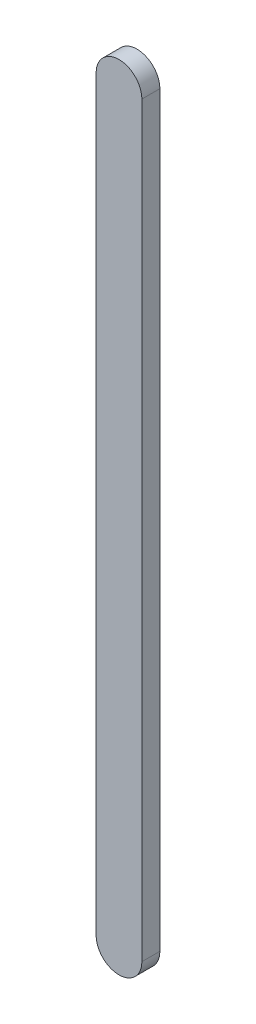
ISO-10303-21;
HEADER;
FILE_DESCRIPTION(('STEP AP214'),'2;1');
FILE_NAME('part.step','',(''),(''),'','','');
FILE_SCHEMA(('AUTOMOTIVE_DESIGN { 1 0 10303 214 1 1 1 1 }'));
ENDSEC;
DATA;
#1=APPLICATION_CONTEXT('core data for automotive mechanical design processes');
#2=APPLICATION_PROTOCOL_DEFINITION('international standard','automotive_design',2000,#1);
#3=PRODUCT_CONTEXT('',#1,'mechanical');
#4=PRODUCT('Part','Part','',(#3));
#5=PRODUCT_RELATED_PRODUCT_CATEGORY('part','',(#4));
#6=PRODUCT_DEFINITION_FORMATION('','',#4);
#7=PRODUCT_DEFINITION_CONTEXT('part definition',#1,'design');
#8=PRODUCT_DEFINITION('design','',#6,#7);
#9=PRODUCT_DEFINITION_SHAPE('','',#8);
#10=(LENGTH_UNIT() NAMED_UNIT(*) SI_UNIT(.MILLI.,.METRE.));
#11=(NAMED_UNIT(*) PLANE_ANGLE_UNIT() SI_UNIT($,.RADIAN.));
#12=(NAMED_UNIT(*) SI_UNIT($,.STERADIAN.) SOLID_ANGLE_UNIT());
#13=UNCERTAINTY_MEASURE_WITH_UNIT(LENGTH_MEASURE(1.E-05),#10,'distance_accuracy_value','');
#14=(GEOMETRIC_REPRESENTATION_CONTEXT(3) GLOBAL_UNCERTAINTY_ASSIGNED_CONTEXT((#13)) GLOBAL_UNIT_ASSIGNED_CONTEXT((#10,
#11,#12)) REPRESENTATION_CONTEXT('',''));
#15=CARTESIAN_POINT('',(0.,0.,0.));
#16=DIRECTION('',(0.,0.,1.));
#17=DIRECTION('',(1.,0.,0.));
#18=AXIS2_PLACEMENT_3D('',#15,#16,#17);
#19=CARTESIAN_POINT('',(92.0496,56.746902,0.));
#20=DIRECTION('',(-1.,0.,0.));
#21=DIRECTION('',(0.,1.,0.));
#22=AXIS2_PLACEMENT_3D('',#19,#20,#21);
#23=PLANE('',#22);
#24=DIRECTION('',(0.,1.,0.));
#25=VECTOR('',#24,1.);
#26=CARTESIAN_POINT('',(92.0496,56.746902,0.1999996));
#27=LINE('',#26,#25);
#28=CARTESIAN_POINT('',(92.0496,56.746902,0.1999996));
#29=VERTEX_POINT('',#28);
#30=CARTESIAN_POINT('',(92.0496,65.0494,0.1999996));
#31=VERTEX_POINT('',#30);
#32=EDGE_CURVE('E11',#29,#31,#27,.T.);
#33=ORIENTED_EDGE('',*,*,#32,.F.);
#34=DIRECTION('',(0.,0.,1.));
#35=VECTOR('',#34,1.);
#36=CARTESIAN_POINT('',(92.0496,56.746902,0.));
#37=LINE('',#36,#35);
#38=CARTESIAN_POINT('',(92.0496,56.746902,0.));
#39=VERTEX_POINT('',#38);
#40=EDGE_CURVE('E24',#39,#29,#37,.T.);
#41=ORIENTED_EDGE('',*,*,#40,.F.);
#42=DIRECTION('',(0.,1.,0.));
#43=VECTOR('',#42,1.);
#44=CARTESIAN_POINT('',(92.0496,56.746902,0.));
#45=LINE('',#44,#43);
#46=CARTESIAN_POINT('',(92.0496,65.0494,0.));
#47=VERTEX_POINT('',#46);
#48=EDGE_CURVE('E75',#39,#47,#45,.T.);
#49=ORIENTED_EDGE('',*,*,#48,.T.);
#50=DIRECTION('',(0.,0.,1.));
#51=VECTOR('',#50,1.);
#52=CARTESIAN_POINT('',(92.0496,65.0494,0.));
#53=LINE('',#52,#51);
#54=EDGE_CURVE('E37',#47,#31,#53,.T.);
#55=ORIENTED_EDGE('',*,*,#54,.T.);
#56=EDGE_LOOP('',(#33,#41,#49,#55));
#57=FACE_BOUND('',#56,.T.);
#58=ADVANCED_FACE('F17',(#57),#23,.F.);
#59=CARTESIAN_POINT('',(91.7956,65.0494,0.));
#60=DIRECTION('',(0.,0.,-1.));
#61=DIRECTION('',(1.,0.,0.));
#62=AXIS2_PLACEMENT_3D('',#59,#60,#61);
#63=CYLINDRICAL_SURFACE('',#62,0.253999999999995);
#64=CARTESIAN_POINT('',(91.7956,65.0494,0.1999996));
#65=DIRECTION('',(0.,0.,1.));
#66=DIRECTION('',(1.,0.,0.));
#67=AXIS2_PLACEMENT_3D('',#64,#65,#66);
#68=CIRCLE('',#67,0.253999999999995);
#69=CARTESIAN_POINT('',(91.5416,65.0494,0.1999996));
#70=VERTEX_POINT('',#69);
#71=EDGE_CURVE('E83',#31,#70,#68,.T.);
#72=ORIENTED_EDGE('',*,*,#71,.F.);
#73=ORIENTED_EDGE('',*,*,#54,.F.);
#74=CARTESIAN_POINT('',(91.7956,65.0494,0.));
#75=DIRECTION('',(0.,0.,1.));
#76=DIRECTION('',(1.,0.,0.));
#77=AXIS2_PLACEMENT_3D('',#74,#75,#76);
#78=CIRCLE('',#77,0.253999999999995);
#79=CARTESIAN_POINT('',(91.5416,65.0494,0.));
#80=VERTEX_POINT('',#79);
#81=EDGE_CURVE('E81',#47,#80,#78,.T.);
#82=ORIENTED_EDGE('',*,*,#81,.T.);
#83=DIRECTION('',(0.,0.,1.));
#84=VECTOR('',#83,1.);
#85=CARTESIAN_POINT('',(91.5416,65.0494,0.));
#86=LINE('',#85,#84);
#87=EDGE_CURVE('E67',#80,#70,#86,.T.);
#88=ORIENTED_EDGE('',*,*,#87,.T.);
#89=EDGE_LOOP('',(#72,#73,#82,#88));
#90=FACE_BOUND('',#89,.T.);
#91=ADVANCED_FACE('F89',(#90),#63,.T.);
#92=CARTESIAN_POINT('',(91.5416,65.0494,0.));
#93=DIRECTION('',(1.,0.,0.));
#94=DIRECTION('',(0.,-1.,0.));
#95=AXIS2_PLACEMENT_3D('',#92,#93,#94);
#96=PLANE('',#95);
#97=DIRECTION('',(0.,-1.,0.));
#98=VECTOR('',#97,1.);
#99=CARTESIAN_POINT('',(91.5416,65.0494,0.1999996));
#100=LINE('',#99,#98);
#101=CARTESIAN_POINT('',(91.5416,56.746902,0.1999996));
#102=VERTEX_POINT('',#101);
#103=EDGE_CURVE('E71',#70,#102,#100,.T.);
#104=ORIENTED_EDGE('',*,*,#103,.F.);
#105=ORIENTED_EDGE('',*,*,#87,.F.);
#106=DIRECTION('',(0.,-1.,0.));
#107=VECTOR('',#106,1.);
#108=CARTESIAN_POINT('',(91.5416,65.0494,0.));
#109=LINE('',#108,#107);
#110=CARTESIAN_POINT('',(91.5416,56.746902,0.));
#111=VERTEX_POINT('',#110);
#112=EDGE_CURVE('E63',#80,#111,#109,.T.);
#113=ORIENTED_EDGE('',*,*,#112,.T.);
#114=DIRECTION('',(0.,0.,1.));
#115=VECTOR('',#114,1.);
#116=CARTESIAN_POINT('',(91.5416,56.746902,0.));
#117=LINE('',#116,#115);
#118=EDGE_CURVE('E53',#111,#102,#117,.T.);
#119=ORIENTED_EDGE('',*,*,#118,.T.);
#120=EDGE_LOOP('',(#104,#105,#113,#119));
#121=FACE_BOUND('',#120,.T.);
#122=ADVANCED_FACE('F66',(#121),#96,.F.);
#123=CARTESIAN_POINT('',(91.7956,56.746902,0.));
#124=DIRECTION('',(0.,0.,-1.));
#125=DIRECTION('',(-1.,0.,0.));
#126=AXIS2_PLACEMENT_3D('',#123,#124,#125);
#127=CYLINDRICAL_SURFACE('',#126,0.253999999999995);
#128=CARTESIAN_POINT('',(91.7956,56.746902,0.1999996));
#129=DIRECTION('',(0.,0.,1.));
#130=DIRECTION('',(-1.,0.,0.));
#131=AXIS2_PLACEMENT_3D('',#128,#129,#130);
#132=CIRCLE('',#131,0.253999999999995);
#133=EDGE_CURVE('E59',#102,#29,#132,.T.);
#134=ORIENTED_EDGE('',*,*,#133,.F.);
#135=ORIENTED_EDGE('',*,*,#118,.F.);
#136=CARTESIAN_POINT('',(91.7956,56.746902,0.));
#137=DIRECTION('',(0.,0.,1.));
#138=DIRECTION('',(-1.,0.,0.));
#139=AXIS2_PLACEMENT_3D('',#136,#137,#138);
#140=CIRCLE('',#139,0.253999999999995);
#141=EDGE_CURVE('E57',#111,#39,#140,.T.);
#142=ORIENTED_EDGE('',*,*,#141,.T.);
#143=ORIENTED_EDGE('',*,*,#40,.T.);
#144=EDGE_LOOP('',(#134,#135,#142,#143));
#145=FACE_BOUND('',#144,.T.);
#146=ADVANCED_FACE('F55',(#145),#127,.T.);
#147=CARTESIAN_POINT('',(92.0496,56.746902,0.));
#148=DIRECTION('',(0.,0.,-1.));
#149=DIRECTION('',(-1.,0.,0.));
#150=AXIS2_PLACEMENT_3D('',#147,#148,#149);
#151=PLANE('',#150);
#152=ORIENTED_EDGE('',*,*,#141,.F.);
#153=ORIENTED_EDGE('',*,*,#112,.F.);
#154=ORIENTED_EDGE('',*,*,#81,.F.);
#155=ORIENTED_EDGE('',*,*,#48,.F.);
#156=EDGE_LOOP('',(#152,#153,#154,#155));
#157=FACE_BOUND('',#156,.T.);
#158=ADVANCED_FACE('F74',(#157),#151,.T.);
#159=CARTESIAN_POINT('',(92.0496,56.746902,0.1999996));
#160=DIRECTION('',(0.,0.,-1.));
#161=DIRECTION('',(-1.,0.,0.));
#162=AXIS2_PLACEMENT_3D('',#159,#160,#161);
#163=PLANE('',#162);
#164=ORIENTED_EDGE('',*,*,#32,.T.);
#165=ORIENTED_EDGE('',*,*,#71,.T.);
#166=ORIENTED_EDGE('',*,*,#103,.T.);
#167=ORIENTED_EDGE('',*,*,#133,.T.);
#168=EDGE_LOOP('',(#164,#165,#166,#167));
#169=FACE_BOUND('',#168,.T.);
#170=ADVANCED_FACE('F91',(#169),#163,.F.);
#171=CLOSED_SHELL('',(#58,#91,#122,#146,#158,#170));
#172=MANIFOLD_SOLID_BREP('B1',#171);
#173=ADVANCED_BREP_SHAPE_REPRESENTATION('',(#18,#172),#14);
#174=SHAPE_DEFINITION_REPRESENTATION(#9,#173);
ENDSEC;
END-ISO-10303-21;
